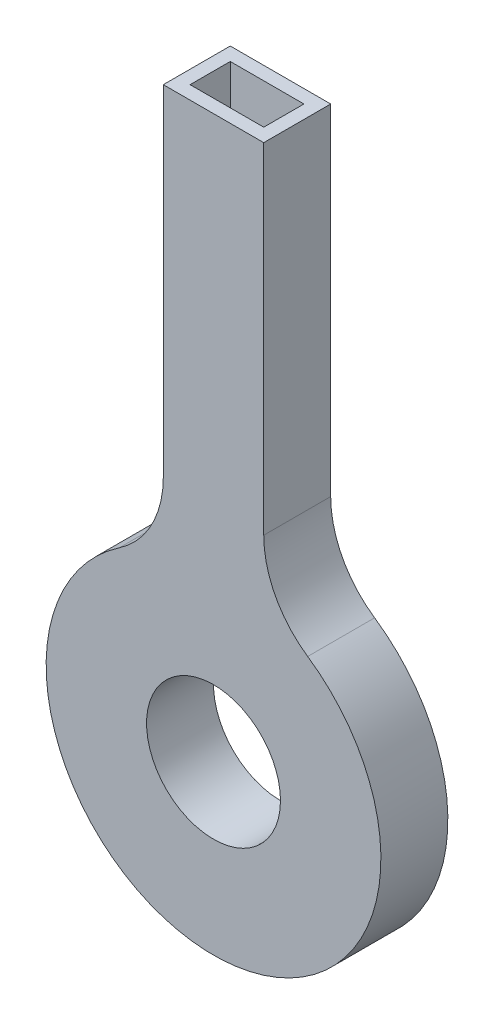
ISO-10303-21;
HEADER;
FILE_DESCRIPTION(('STEP AP214'),'2;1');
FILE_NAME('part.step','',(''),(''),'','','');
FILE_SCHEMA(('AUTOMOTIVE_DESIGN { 1 0 10303 214 1 1 1 1 }'));
ENDSEC;
DATA;
#1=APPLICATION_CONTEXT('core data for automotive mechanical design processes');
#2=APPLICATION_PROTOCOL_DEFINITION('international standard','automotive_design',2000,#1);
#3=PRODUCT_CONTEXT('',#1,'mechanical');
#4=PRODUCT('Part','Part','',(#3));
#5=PRODUCT_RELATED_PRODUCT_CATEGORY('part','',(#4));
#6=PRODUCT_DEFINITION_FORMATION('','',#4);
#7=PRODUCT_DEFINITION_CONTEXT('part definition',#1,'design');
#8=PRODUCT_DEFINITION('design','',#6,#7);
#9=PRODUCT_DEFINITION_SHAPE('','',#8);
#10=(LENGTH_UNIT() NAMED_UNIT(*) SI_UNIT(.MILLI.,.METRE.));
#11=(NAMED_UNIT(*) PLANE_ANGLE_UNIT() SI_UNIT($,.RADIAN.));
#12=(NAMED_UNIT(*) SI_UNIT($,.STERADIAN.) SOLID_ANGLE_UNIT());
#13=UNCERTAINTY_MEASURE_WITH_UNIT(LENGTH_MEASURE(1.E-05),#10,'distance_accuracy_value','');
#14=(GEOMETRIC_REPRESENTATION_CONTEXT(3) GLOBAL_UNCERTAINTY_ASSIGNED_CONTEXT((#13)) GLOBAL_UNIT_ASSIGNED_CONTEXT((#10,
#11,#12)) REPRESENTATION_CONTEXT('',''));
#15=CARTESIAN_POINT('',(0.,0.,0.));
#16=DIRECTION('',(0.,0.,1.));
#17=DIRECTION('',(1.,0.,0.));
#18=AXIS2_PLACEMENT_3D('',#15,#16,#17);
#19=CARTESIAN_POINT('',(0.,0.,10.));
#20=DIRECTION('',(0.,0.,-1.));
#21=DIRECTION('',(-1.,0.,0.));
#22=AXIS2_PLACEMENT_3D('',#19,#20,#21);
#23=CYLINDRICAL_SURFACE('',#22,25.);
#24=CARTESIAN_POINT('',(0.,0.,10.));
#25=DIRECTION('',(0.,0.,1.));
#26=DIRECTION('',(1.,0.,0.));
#27=AXIS2_PLACEMENT_3D('',#24,#25,#26);
#28=CIRCLE('',#27,25.);
#29=CARTESIAN_POINT('',(-14.0625,20.6699321176921,10.));
#30=VERTEX_POINT('',#29);
#31=CARTESIAN_POINT('',(14.0625,20.6699321176921,10.));
#32=VERTEX_POINT('',#31);
#33=EDGE_CURVE('E175',#30,#32,#28,.T.);
#34=ORIENTED_EDGE('',*,*,#33,.F.);
#35=DIRECTION('',(0.,0.,-1.));
#36=VECTOR('',#35,1.);
#37=CARTESIAN_POINT('',(-14.0625,20.6699321176921,10.));
#38=LINE('',#37,#36);
#39=CARTESIAN_POINT('',(-14.0625,20.6699321176921,0.));
#40=VERTEX_POINT('',#39);
#41=EDGE_CURVE('E182',#30,#40,#38,.T.);
#42=ORIENTED_EDGE('',*,*,#41,.T.);
#43=CARTESIAN_POINT('',(0.,0.,0.));
#44=DIRECTION('',(0.,0.,1.));
#45=DIRECTION('',(1.,0.,0.));
#46=AXIS2_PLACEMENT_3D('',#43,#44,#45);
#47=CIRCLE('',#46,25.);
#48=CARTESIAN_POINT('',(14.0625,20.6699321176921,0.));
#49=VERTEX_POINT('',#48);
#50=EDGE_CURVE('E172',#40,#49,#47,.T.);
#51=ORIENTED_EDGE('',*,*,#50,.T.);
#52=DIRECTION('',(0.,0.,-1.));
#53=VECTOR('',#52,1.);
#54=CARTESIAN_POINT('',(14.0625,20.6699321176921,10.));
#55=LINE('',#54,#53);
#56=EDGE_CURVE('E178',#49,#32,#55,.F.);
#57=ORIENTED_EDGE('',*,*,#56,.T.);
#58=EDGE_LOOP('',(#34,#42,#51,#57));
#59=FACE_BOUND('',#58,.T.);
#60=ADVANCED_FACE('F33',(#59),#23,.T.);
#61=CARTESIAN_POINT('',(0.,0.,10.));
#62=DIRECTION('',(0.,0.,1.));
#63=DIRECTION('',(1.,0.,0.));
#64=AXIS2_PLACEMENT_3D('',#61,#62,#63);
#65=PLANE('',#64);
#66=DIRECTION('',(0.,-1.,0.));
#67=VECTOR('',#66,1.);
#68=CARTESIAN_POINT('',(-7.5,23.8484800354236,10.));
#69=LINE('',#68,#67);
#70=CARTESIAN_POINT('',(-7.5,83.8484800354236,10.));
#71=VERTEX_POINT('',#70);
#72=CARTESIAN_POINT('',(-7.5,33.0718913883074,10.));
#73=VERTEX_POINT('',#72);
#74=EDGE_CURVE('E161',#71,#73,#69,.T.);
#75=ORIENTED_EDGE('',*,*,#74,.T.);
#76=CARTESIAN_POINT('',(-22.5,33.0718913883074,10.));
#77=DIRECTION('',(0.,0.,1.));
#78=DIRECTION('',(1.,0.,0.));
#79=AXIS2_PLACEMENT_3D('',#76,#77,#78);
#80=CIRCLE('',#79,15.);
#81=EDGE_CURVE('E191',#73,#30,#80,.F.);
#82=ORIENTED_EDGE('',*,*,#81,.T.);
#83=ORIENTED_EDGE('',*,*,#33,.T.);
#84=CARTESIAN_POINT('',(22.5,33.0718913883074,10.));
#85=DIRECTION('',(0.,0.,1.));
#86=DIRECTION('',(1.,0.,0.));
#87=AXIS2_PLACEMENT_3D('',#84,#85,#86);
#88=CIRCLE('',#87,15.);
#89=CARTESIAN_POINT('',(7.5,33.0718913883074,10.));
#90=VERTEX_POINT('',#89);
#91=EDGE_CURVE('E11',#32,#90,#88,.F.);
#92=ORIENTED_EDGE('',*,*,#91,.T.);
#93=DIRECTION('',(0.,1.,0.));
#94=VECTOR('',#93,1.);
#95=CARTESIAN_POINT('',(7.5,23.8484800354236,10.));
#96=LINE('',#95,#94);
#97=CARTESIAN_POINT('',(7.5,83.8484800354236,10.));
#98=VERTEX_POINT('',#97);
#99=EDGE_CURVE('E158',#90,#98,#96,.T.);
#100=ORIENTED_EDGE('',*,*,#99,.T.);
#101=DIRECTION('',(-1.,0.,0.));
#102=VECTOR('',#101,1.);
#103=CARTESIAN_POINT('',(-7.5,83.8484800354236,10.));
#104=LINE('',#103,#102);
#105=EDGE_CURVE('E151',#98,#71,#104,.T.);
#106=ORIENTED_EDGE('',*,*,#105,.T.);
#107=EDGE_LOOP('',(#75,#82,#83,#92,#100,#106));
#108=FACE_BOUND('',#107,.T.);
#109=CARTESIAN_POINT('',(0.,0.,10.));
#110=DIRECTION('',(0.,0.,1.));
#111=DIRECTION('',(1.,0.,0.));
#112=AXIS2_PLACEMENT_3D('',#109,#110,#111);
#113=CIRCLE('',#112,10.);
#114=CARTESIAN_POINT('',(10.,0.,10.));
#115=VERTEX_POINT('',#114);
#116=EDGE_CURVE('E169',#115,#115,#113,.T.);
#117=ORIENTED_EDGE('',*,*,#116,.F.);
#118=EDGE_LOOP('',(#117));
#119=FACE_BOUND('',#118,.T.);
#120=ADVANCED_FACE('F204',(#108,#119),#65,.T.);
#121=CARTESIAN_POINT('',(0.,0.,0.));
#122=DIRECTION('',(0.,0.,1.));
#123=DIRECTION('',(1.,0.,0.));
#124=AXIS2_PLACEMENT_3D('',#121,#122,#123);
#125=PLANE('',#124);
#126=DIRECTION('',(0.,1.,0.));
#127=VECTOR('',#126,1.);
#128=CARTESIAN_POINT('',(7.5,23.8484800354236,0.));
#129=LINE('',#128,#127);
#130=CARTESIAN_POINT('',(7.5,33.0718913883074,0.));
#131=VERTEX_POINT('',#130);
#132=CARTESIAN_POINT('',(7.5,83.8484800354236,0.));
#133=VERTEX_POINT('',#132);
#134=EDGE_CURVE('E153',#131,#133,#129,.T.);
#135=ORIENTED_EDGE('',*,*,#134,.F.);
#136=CARTESIAN_POINT('',(22.5,33.0718913883074,0.));
#137=DIRECTION('',(0.,0.,1.));
#138=DIRECTION('',(1.,0.,0.));
#139=AXIS2_PLACEMENT_3D('',#136,#137,#138);
#140=CIRCLE('',#139,15.);
#141=EDGE_CURVE('E41',#131,#49,#140,.T.);
#142=ORIENTED_EDGE('',*,*,#141,.T.);
#143=ORIENTED_EDGE('',*,*,#50,.F.);
#144=CARTESIAN_POINT('',(-22.5,33.0718913883074,0.));
#145=DIRECTION('',(0.,0.,1.));
#146=DIRECTION('',(1.,0.,0.));
#147=AXIS2_PLACEMENT_3D('',#144,#145,#146);
#148=CIRCLE('',#147,15.);
#149=CARTESIAN_POINT('',(-7.5,33.0718913883074,0.));
#150=VERTEX_POINT('',#149);
#151=EDGE_CURVE('E189',#40,#150,#148,.T.);
#152=ORIENTED_EDGE('',*,*,#151,.T.);
#153=DIRECTION('',(0.,-1.,0.));
#154=VECTOR('',#153,1.);
#155=CARTESIAN_POINT('',(-7.5,23.8484800354236,0.));
#156=LINE('',#155,#154);
#157=CARTESIAN_POINT('',(-7.5,83.8484800354236,0.));
#158=VERTEX_POINT('',#157);
#159=EDGE_CURVE('E155',#158,#150,#156,.T.);
#160=ORIENTED_EDGE('',*,*,#159,.F.);
#161=DIRECTION('',(-1.,0.,0.));
#162=VECTOR('',#161,1.);
#163=CARTESIAN_POINT('',(-7.5,83.8484800354236,0.));
#164=LINE('',#163,#162);
#165=EDGE_CURVE('E148',#133,#158,#164,.T.);
#166=ORIENTED_EDGE('',*,*,#165,.F.);
#167=EDGE_LOOP('',(#135,#142,#143,#152,#160,#166));
#168=FACE_BOUND('',#167,.T.);
#169=CARTESIAN_POINT('',(0.,0.,0.));
#170=DIRECTION('',(0.,0.,1.));
#171=DIRECTION('',(1.,0.,0.));
#172=AXIS2_PLACEMENT_3D('',#169,#170,#171);
#173=CIRCLE('',#172,10.);
#174=CARTESIAN_POINT('',(10.,0.,0.));
#175=VERTEX_POINT('',#174);
#176=EDGE_CURVE('E160',#175,#175,#173,.T.);
#177=ORIENTED_EDGE('',*,*,#176,.T.);
#178=EDGE_LOOP('',(#177));
#179=FACE_BOUND('',#178,.T.);
#180=ADVANCED_FACE('F195',(#168,#179),#125,.F.);
#181=CARTESIAN_POINT('',(0.,0.,10.));
#182=DIRECTION('',(0.,0.,-1.));
#183=DIRECTION('',(-1.,0.,0.));
#184=AXIS2_PLACEMENT_3D('',#181,#182,#183);
#185=CYLINDRICAL_SURFACE('',#184,10.);
#186=ORIENTED_EDGE('',*,*,#116,.T.);
#187=EDGE_LOOP('',(#186));
#188=FACE_BOUND('',#187,.T.);
#189=ORIENTED_EDGE('',*,*,#176,.F.);
#190=EDGE_LOOP('',(#189));
#191=FACE_BOUND('',#190,.T.);
#192=ADVANCED_FACE('F221',(#188,#191),#185,.F.);
#193=CARTESIAN_POINT('',(-7.5,23.8484800354236,71.8465843842649));
#194=DIRECTION('',(1.,0.,0.));
#195=DIRECTION('',(0.,0.,-1.));
#196=AXIS2_PLACEMENT_3D('',#193,#194,#195);
#197=PLANE('',#196);
#198=ORIENTED_EDGE('',*,*,#159,.T.);
#199=DIRECTION('',(0.,0.,1.));
#200=VECTOR('',#199,1.);
#201=CARTESIAN_POINT('',(-7.5,33.0718913883074,10.));
#202=LINE('',#201,#200);
#203=EDGE_CURVE('E185',#150,#73,#202,.T.);
#204=ORIENTED_EDGE('',*,*,#203,.T.);
#205=ORIENTED_EDGE('',*,*,#74,.F.);
#206=DIRECTION('',(0.,0.,-1.));
#207=VECTOR('',#206,1.);
#208=CARTESIAN_POINT('',(-7.5,83.8484800354236,71.8465843842649));
#209=LINE('',#208,#207);
#210=EDGE_CURVE('E144',#71,#158,#209,.T.);
#211=ORIENTED_EDGE('',*,*,#210,.T.);
#212=EDGE_LOOP('',(#198,#204,#205,#211));
#213=FACE_BOUND('',#212,.T.);
#214=ADVANCED_FACE('F219',(#213),#197,.F.);
#215=CARTESIAN_POINT('',(7.5,23.8484800354236,71.8465843842649));
#216=DIRECTION('',(-1.,0.,0.));
#217=DIRECTION('',(0.,0.,1.));
#218=AXIS2_PLACEMENT_3D('',#215,#216,#217);
#219=PLANE('',#218);
#220=ORIENTED_EDGE('',*,*,#99,.F.);
#221=DIRECTION('',(0.,0.,1.));
#222=VECTOR('',#221,1.);
#223=CARTESIAN_POINT('',(7.5,33.0718913883074,0.));
#224=LINE('',#223,#222);
#225=EDGE_CURVE('E187',#90,#131,#224,.F.);
#226=ORIENTED_EDGE('',*,*,#225,.T.);
#227=ORIENTED_EDGE('',*,*,#134,.T.);
#228=DIRECTION('',(0.,0.,-1.));
#229=VECTOR('',#228,1.);
#230=CARTESIAN_POINT('',(7.5,83.8484800354236,71.8465843842649));
#231=LINE('',#230,#229);
#232=EDGE_CURVE('E152',#98,#133,#231,.T.);
#233=ORIENTED_EDGE('',*,*,#232,.F.);
#234=EDGE_LOOP('',(#220,#226,#227,#233));
#235=FACE_BOUND('',#234,.T.);
#236=ADVANCED_FACE('F208',(#235),#219,.F.);
#237=CARTESIAN_POINT('',(-7.5,83.8484800354236,71.8465843842649));
#238=DIRECTION('',(0.,-1.,0.));
#239=DIRECTION('',(0.,0.,-1.));
#240=AXIS2_PLACEMENT_3D('',#237,#238,#239);
#241=PLANE('',#240);
#242=DIRECTION('',(1.,0.,0.));
#243=VECTOR('',#242,1.);
#244=CARTESIAN_POINT('',(-5.5,83.8484800354236,7.99999999999999));
#245=LINE('',#244,#243);
#246=CARTESIAN_POINT('',(-5.5,83.8484800354236,7.99999999999999));
#247=VERTEX_POINT('',#246);
#248=CARTESIAN_POINT('',(5.5,83.8484800354236,8.));
#249=VERTEX_POINT('',#248);
#250=EDGE_CURVE('E138',#247,#249,#245,.T.);
#251=ORIENTED_EDGE('',*,*,#250,.F.);
#252=DIRECTION('',(0.,0.,1.));
#253=VECTOR('',#252,1.);
#254=CARTESIAN_POINT('',(-5.5,83.8484800354236,2.));
#255=LINE('',#254,#253);
#256=CARTESIAN_POINT('',(-5.5,83.8484800354236,2.));
#257=VERTEX_POINT('',#256);
#258=EDGE_CURVE('E48',#257,#247,#255,.T.);
#259=ORIENTED_EDGE('',*,*,#258,.F.);
#260=DIRECTION('',(-1.,0.,0.));
#261=VECTOR('',#260,1.);
#262=CARTESIAN_POINT('',(-5.5,83.8484800354236,2.));
#263=LINE('',#262,#261);
#264=CARTESIAN_POINT('',(5.5,83.8484800354236,2.));
#265=VERTEX_POINT('',#264);
#266=EDGE_CURVE('E129',#265,#257,#263,.T.);
#267=ORIENTED_EDGE('',*,*,#266,.F.);
#268=DIRECTION('',(0.,0.,-1.));
#269=VECTOR('',#268,1.);
#270=CARTESIAN_POINT('',(5.5,83.8484800354236,2.));
#271=LINE('',#270,#269);
#272=EDGE_CURVE('E132',#249,#265,#271,.T.);
#273=ORIENTED_EDGE('',*,*,#272,.F.);
#274=EDGE_LOOP('',(#251,#259,#267,#273));
#275=FACE_BOUND('',#274,.T.);
#276=ORIENTED_EDGE('',*,*,#105,.F.);
#277=ORIENTED_EDGE('',*,*,#232,.T.);
#278=ORIENTED_EDGE('',*,*,#165,.T.);
#279=ORIENTED_EDGE('',*,*,#210,.F.);
#280=EDGE_LOOP('',(#276,#277,#278,#279));
#281=FACE_BOUND('',#280,.T.);
#282=ADVANCED_FACE('F211',(#275,#281),#241,.F.);
#283=CARTESIAN_POINT('',(-22.5,33.0718913883074,10.));
#284=DIRECTION('',(0.,0.,-1.));
#285=DIRECTION('',(-1.,0.,0.));
#286=AXIS2_PLACEMENT_3D('',#283,#284,#285);
#287=CYLINDRICAL_SURFACE('',#286,15.);
#288=ORIENTED_EDGE('',*,*,#81,.F.);
#289=ORIENTED_EDGE('',*,*,#203,.F.);
#290=ORIENTED_EDGE('',*,*,#151,.F.);
#291=ORIENTED_EDGE('',*,*,#41,.F.);
#292=EDGE_LOOP('',(#288,#289,#290,#291));
#293=FACE_BOUND('',#292,.T.);
#294=ADVANCED_FACE('F217',(#293),#287,.F.);
#295=CARTESIAN_POINT('',(22.5,33.0718913883074,10.));
#296=DIRECTION('',(0.,0.,-1.));
#297=DIRECTION('',(-1.,0.,0.));
#298=AXIS2_PLACEMENT_3D('',#295,#296,#297);
#299=CYLINDRICAL_SURFACE('',#298,15.);
#300=ORIENTED_EDGE('',*,*,#91,.F.);
#301=ORIENTED_EDGE('',*,*,#56,.F.);
#302=ORIENTED_EDGE('',*,*,#141,.F.);
#303=ORIENTED_EDGE('',*,*,#225,.F.);
#304=EDGE_LOOP('',(#300,#301,#302,#303));
#305=FACE_BOUND('',#304,.T.);
#306=ADVANCED_FACE('F35',(#305),#299,.F.);
#307=CARTESIAN_POINT('',(-5.5,58.8484800354236,2.));
#308=DIRECTION('',(-1.,0.,0.));
#309=DIRECTION('',(0.,0.,1.));
#310=AXIS2_PLACEMENT_3D('',#307,#308,#309);
#311=PLANE('',#310);
#312=ORIENTED_EDGE('',*,*,#258,.T.);
#313=DIRECTION('',(0.,1.,0.));
#314=VECTOR('',#313,1.);
#315=CARTESIAN_POINT('',(-5.5,58.8484800354236,7.99999999999999));
#316=LINE('',#315,#314);
#317=CARTESIAN_POINT('',(-5.5,58.8484800354236,7.99999999999999));
#318=VERTEX_POINT('',#317);
#319=EDGE_CURVE('E107',#318,#247,#316,.T.);
#320=ORIENTED_EDGE('',*,*,#319,.F.);
#321=DIRECTION('',(0.,0.,1.));
#322=VECTOR('',#321,1.);
#323=CARTESIAN_POINT('',(-5.5,58.8484800354236,2.));
#324=LINE('',#323,#322);
#325=CARTESIAN_POINT('',(-5.5,58.8484800354236,2.));
#326=VERTEX_POINT('',#325);
#327=EDGE_CURVE('E111',#326,#318,#324,.T.);
#328=ORIENTED_EDGE('',*,*,#327,.F.);
#329=DIRECTION('',(0.,1.,0.));
#330=VECTOR('',#329,1.);
#331=CARTESIAN_POINT('',(-5.5,58.8484800354236,2.));
#332=LINE('',#331,#330);
#333=EDGE_CURVE('E142',#326,#257,#332,.T.);
#334=ORIENTED_EDGE('',*,*,#333,.T.);
#335=EDGE_LOOP('',(#312,#320,#328,#334));
#336=FACE_BOUND('',#335,.T.);
#337=ADVANCED_FACE('F109',(#336),#311,.F.);
#338=CARTESIAN_POINT('',(-5.5,58.8484800354236,2.));
#339=DIRECTION('',(0.,0.,-1.));
#340=DIRECTION('',(-1.,0.,0.));
#341=AXIS2_PLACEMENT_3D('',#338,#339,#340);
#342=PLANE('',#341);
#343=ORIENTED_EDGE('',*,*,#266,.T.);
#344=ORIENTED_EDGE('',*,*,#333,.F.);
#345=DIRECTION('',(-1.,0.,0.));
#346=VECTOR('',#345,1.);
#347=CARTESIAN_POINT('',(-5.5,58.8484800354236,2.));
#348=LINE('',#347,#346);
#349=CARTESIAN_POINT('',(5.5,58.8484800354236,2.));
#350=VERTEX_POINT('',#349);
#351=EDGE_CURVE('E117',#350,#326,#348,.T.);
#352=ORIENTED_EDGE('',*,*,#351,.F.);
#353=DIRECTION('',(0.,1.,0.));
#354=VECTOR('',#353,1.);
#355=CARTESIAN_POINT('',(5.5,58.8484800354236,2.));
#356=LINE('',#355,#354);
#357=EDGE_CURVE('E145',#350,#265,#356,.T.);
#358=ORIENTED_EDGE('',*,*,#357,.T.);
#359=EDGE_LOOP('',(#343,#344,#352,#358));
#360=FACE_BOUND('',#359,.T.);
#361=ADVANCED_FACE('F249',(#360),#342,.F.);
#362=CARTESIAN_POINT('',(5.5,58.8484800354236,2.));
#363=DIRECTION('',(1.,0.,0.));
#364=DIRECTION('',(0.,0.,-1.));
#365=AXIS2_PLACEMENT_3D('',#362,#363,#364);
#366=PLANE('',#365);
#367=ORIENTED_EDGE('',*,*,#272,.T.);
#368=ORIENTED_EDGE('',*,*,#357,.F.);
#369=DIRECTION('',(0.,0.,-1.));
#370=VECTOR('',#369,1.);
#371=CARTESIAN_POINT('',(5.5,58.8484800354236,2.));
#372=LINE('',#371,#370);
#373=CARTESIAN_POINT('',(5.5,58.8484800354236,8.));
#374=VERTEX_POINT('',#373);
#375=EDGE_CURVE('E125',#374,#350,#372,.T.);
#376=ORIENTED_EDGE('',*,*,#375,.F.);
#377=DIRECTION('',(0.,1.,0.));
#378=VECTOR('',#377,1.);
#379=CARTESIAN_POINT('',(5.5,58.8484800354236,8.));
#380=LINE('',#379,#378);
#381=EDGE_CURVE('E116',#374,#249,#380,.T.);
#382=ORIENTED_EDGE('',*,*,#381,.T.);
#383=EDGE_LOOP('',(#367,#368,#376,#382));
#384=FACE_BOUND('',#383,.T.);
#385=ADVANCED_FACE('F252',(#384),#366,.F.);
#386=CARTESIAN_POINT('',(-5.5,58.8484800354236,7.99999999999999));
#387=DIRECTION('',(0.,0.,1.));
#388=DIRECTION('',(1.,0.,0.));
#389=AXIS2_PLACEMENT_3D('',#386,#387,#388);
#390=PLANE('',#389);
#391=ORIENTED_EDGE('',*,*,#250,.T.);
#392=ORIENTED_EDGE('',*,*,#381,.F.);
#393=DIRECTION('',(1.,0.,0.));
#394=VECTOR('',#393,1.);
#395=CARTESIAN_POINT('',(-5.5,58.8484800354236,7.99999999999999));
#396=LINE('',#395,#394);
#397=EDGE_CURVE('E120',#318,#374,#396,.T.);
#398=ORIENTED_EDGE('',*,*,#397,.F.);
#399=ORIENTED_EDGE('',*,*,#319,.T.);
#400=EDGE_LOOP('',(#391,#392,#398,#399));
#401=FACE_BOUND('',#400,.T.);
#402=ADVANCED_FACE('F121',(#401),#390,.F.);
#403=CARTESIAN_POINT('',(0.,58.8484800354236,0.));
#404=DIRECTION('',(0.,1.,0.));
#405=DIRECTION('',(0.,0.,1.));
#406=AXIS2_PLACEMENT_3D('',#403,#404,#405);
#407=PLANE('',#406);
#408=ORIENTED_EDGE('',*,*,#327,.T.);
#409=ORIENTED_EDGE('',*,*,#397,.T.);
#410=ORIENTED_EDGE('',*,*,#375,.T.);
#411=ORIENTED_EDGE('',*,*,#351,.T.);
#412=EDGE_LOOP('',(#408,#409,#410,#411));
#413=FACE_BOUND('',#412,.T.);
#414=ADVANCED_FACE('F127',(#413),#407,.T.);
#415=CLOSED_SHELL('',(#60,#120,#180,#192,#214,#236,#282,#294,#306,#337,#361,#385,#402,#414));
#416=MANIFOLD_SOLID_BREP('B2',#415);
#417=ADVANCED_BREP_SHAPE_REPRESENTATION('',(#18,#416),#14);
#418=SHAPE_DEFINITION_REPRESENTATION(#9,#417);
ENDSEC;
END-ISO-10303-21;
